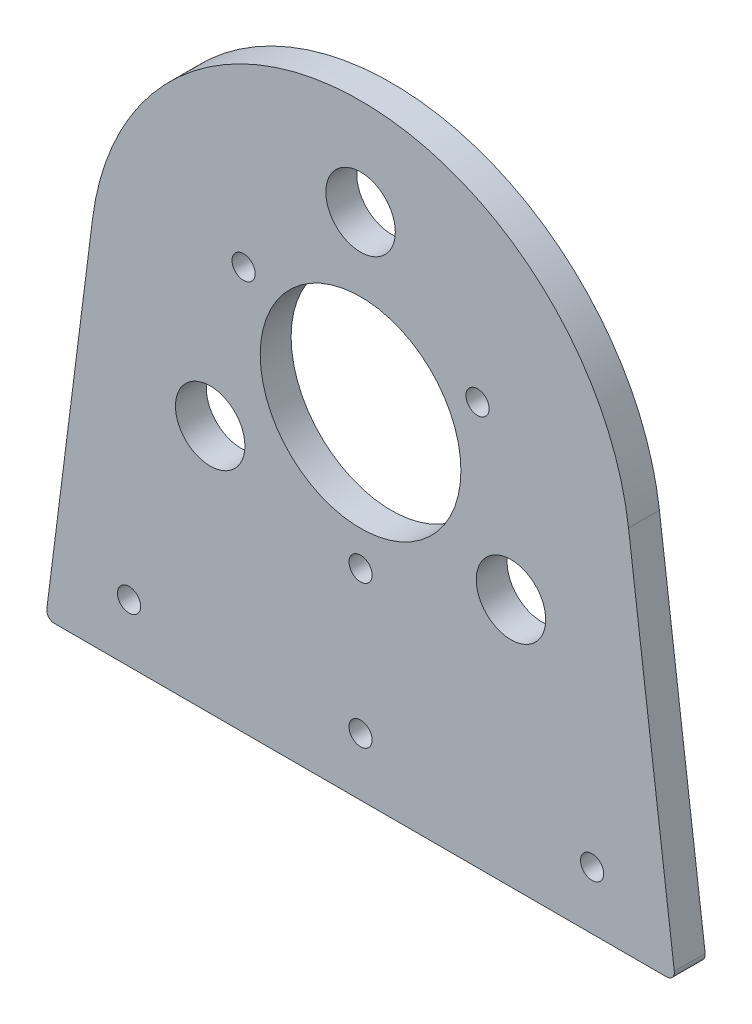
ISO-10303-21;
HEADER;
FILE_DESCRIPTION(('STEP AP214'),'2;1');
FILE_NAME('part.step','',(''),(''),'','','');
FILE_SCHEMA(('AUTOMOTIVE_DESIGN { 1 0 10303 214 1 1 1 1 }'));
ENDSEC;
DATA;
#1=APPLICATION_CONTEXT('core data for automotive mechanical design processes');
#2=APPLICATION_PROTOCOL_DEFINITION('international standard','automotive_design',2000,#1);
#3=PRODUCT_CONTEXT('',#1,'mechanical');
#4=PRODUCT('Part','Part','',(#3));
#5=PRODUCT_RELATED_PRODUCT_CATEGORY('part','',(#4));
#6=PRODUCT_DEFINITION_FORMATION('','',#4);
#7=PRODUCT_DEFINITION_CONTEXT('part definition',#1,'design');
#8=PRODUCT_DEFINITION('design','',#6,#7);
#9=PRODUCT_DEFINITION_SHAPE('','',#8);
#10=(LENGTH_UNIT() NAMED_UNIT(*) SI_UNIT(.MILLI.,.METRE.));
#11=(NAMED_UNIT(*) PLANE_ANGLE_UNIT() SI_UNIT($,.RADIAN.));
#12=(NAMED_UNIT(*) SI_UNIT($,.STERADIAN.) SOLID_ANGLE_UNIT());
#13=UNCERTAINTY_MEASURE_WITH_UNIT(LENGTH_MEASURE(1.E-05),#10,'distance_accuracy_value','');
#14=(GEOMETRIC_REPRESENTATION_CONTEXT(3) GLOBAL_UNCERTAINTY_ASSIGNED_CONTEXT((#13)) GLOBAL_UNIT_ASSIGNED_CONTEXT((#10,
#11,#12)) REPRESENTATION_CONTEXT('',''));
#15=CARTESIAN_POINT('',(0.,0.,0.));
#16=DIRECTION('',(0.,0.,1.));
#17=DIRECTION('',(1.,0.,0.));
#18=AXIS2_PLACEMENT_3D('',#15,#16,#17);
#19=CARTESIAN_POINT('',(0.,0.,4.));
#20=DIRECTION('',(0.,0.,1.));
#21=DIRECTION('',(1.,0.,0.));
#22=AXIS2_PLACEMENT_3D('',#19,#20,#21);
#23=PLANE('',#22);
#24=DIRECTION('',(1.,0.,0.));
#25=VECTOR('',#24,1.);
#26=CARTESIAN_POINT('',(-88.7167777972279,-43.5,4.));
#27=LINE('',#26,#25);
#28=CARTESIAN_POINT('',(-39.6607127436829,-43.5,4.));
#29=VERTEX_POINT('',#28);
#30=CARTESIAN_POINT('',(39.6607127436829,-43.5,4.));
#31=VERTEX_POINT('',#30);
#32=EDGE_CURVE('E162',#29,#31,#27,.T.);
#33=ORIENTED_EDGE('',*,*,#32,.T.);
#34=CARTESIAN_POINT('',(39.6607127436829,-42.5,4.));
#35=DIRECTION('',(0.,0.,1.));
#36=DIRECTION('',(1.,0.,0.));
#37=AXIS2_PLACEMENT_3D('',#34,#35,#36);
#38=CIRCLE('',#37,1.);
#39=CARTESIAN_POINT('',(40.6527706798289,-42.3742182392805,4.));
#40=VERTEX_POINT('',#39);
#41=EDGE_CURVE('E112',#31,#40,#38,.T.);
#42=ORIENTED_EDGE('',*,*,#41,.T.);
#43=DIRECTION('',(0.125781760719489,-0.992057936146022,0.));
#44=VECTOR('',#43,1.);
#45=CARTESIAN_POINT('',(34.7220277651108,4.40236162518213,4.));
#46=LINE('',#45,#44);
#47=CARTESIAN_POINT('',(34.7220277651108,4.40236162518213,4.));
#48=VERTEX_POINT('',#47);
#49=EDGE_CURVE('E93',#48,#40,#46,.T.);
#50=ORIENTED_EDGE('',*,*,#49,.F.);
#51=CARTESIAN_POINT('',(0.,0.,4.));
#52=DIRECTION('',(0.,0.,1.));
#53=DIRECTION('',(1.,0.,0.));
#54=AXIS2_PLACEMENT_3D('',#51,#52,#53);
#55=CIRCLE('',#54,35.);
#56=CARTESIAN_POINT('',(-34.7220277651108,4.40236162518212,4.));
#57=VERTEX_POINT('',#56);
#58=EDGE_CURVE('E103',#48,#57,#55,.T.);
#59=ORIENTED_EDGE('',*,*,#58,.T.);
#60=DIRECTION('',(0.125781760719489,0.992057936146022,0.));
#61=VECTOR('',#60,1.);
#62=CARTESIAN_POINT('',(-34.7220277651108,4.40236162518211,4.));
#63=LINE('',#62,#61);
#64=CARTESIAN_POINT('',(-40.6527706798289,-42.3742182392805,4.));
#65=VERTEX_POINT('',#64);
#66=EDGE_CURVE('E113',#65,#57,#63,.T.);
#67=ORIENTED_EDGE('',*,*,#66,.F.);
#68=CARTESIAN_POINT('',(-39.6607127436829,-42.5,4.));
#69=DIRECTION('',(0.,0.,1.));
#70=DIRECTION('',(1.,0.,0.));
#71=AXIS2_PLACEMENT_3D('',#68,#69,#70);
#72=CIRCLE('',#71,1.);
#73=EDGE_CURVE('E147',#65,#29,#72,.T.);
#74=ORIENTED_EDGE('',*,*,#73,.T.);
#75=EDGE_LOOP('',(#33,#42,#50,#59,#67,#74));
#76=FACE_BOUND('',#75,.T.);
#77=CARTESIAN_POINT('',(0.,-36.,4.));
#78=DIRECTION('',(0.,0.,-1.));
#79=DIRECTION('',(-1.,0.,0.));
#80=AXIS2_PLACEMENT_3D('',#77,#78,#79);
#81=CIRCLE('',#80,1.5);
#82=CARTESIAN_POINT('',(-1.50000000000001,-36.,4.));
#83=VERTEX_POINT('',#82);
#84=EDGE_CURVE('E202',#83,#83,#81,.T.);
#85=ORIENTED_EDGE('',*,*,#84,.T.);
#86=EDGE_LOOP('',(#85));
#87=FACE_BOUND('',#86,.T.);
#88=CARTESIAN_POINT('',(-19.4855715851501,-11.2499999999997,4.));
#89=DIRECTION('',(0.,0.,1.));
#90=DIRECTION('',(-0.499999999999986,0.866025403784447,0.));
#91=AXIS2_PLACEMENT_3D('',#88,#89,#90);
#92=CIRCLE('',#91,4.5);
#93=CARTESIAN_POINT('',(-21.73557158515,-7.35288568296967,4.));
#94=VERTEX_POINT('',#93);
#95=EDGE_CURVE('E141',#94,#94,#92,.T.);
#96=ORIENTED_EDGE('',*,*,#95,.F.);
#97=EDGE_LOOP('',(#96));
#98=FACE_BOUND('',#97,.T.);
#99=CARTESIAN_POINT('',(19.4855715851498,-11.2500000000002,4.));
#100=DIRECTION('',(0.,0.,1.));
#101=DIRECTION('',(-0.500000000000007,-0.866025403784435,0.));
#102=AXIS2_PLACEMENT_3D('',#99,#100,#101);
#103=CIRCLE('',#102,4.5);
#104=CARTESIAN_POINT('',(17.2355715851497,-15.1471143170301,4.));
#105=VERTEX_POINT('',#104);
#106=EDGE_CURVE('E137',#105,#105,#103,.T.);
#107=ORIENTED_EDGE('',*,*,#106,.F.);
#108=EDGE_LOOP('',(#107));
#109=FACE_BOUND('',#108,.T.);
#110=CARTESIAN_POINT('',(-30.,-36.,4.));
#111=DIRECTION('',(0.,0.,1.));
#112=DIRECTION('',(1.,0.,0.));
#113=AXIS2_PLACEMENT_3D('',#110,#111,#112);
#114=CIRCLE('',#113,1.5);
#115=CARTESIAN_POINT('',(-28.5,-36.,4.));
#116=VERTEX_POINT('',#115);
#117=EDGE_CURVE('E211',#116,#116,#114,.T.);
#118=ORIENTED_EDGE('',*,*,#117,.F.);
#119=EDGE_LOOP('',(#118));
#120=FACE_BOUND('',#119,.T.);
#121=CARTESIAN_POINT('',(30.,-36.,4.));
#122=DIRECTION('',(0.,0.,-1.));
#123=DIRECTION('',(-1.,0.,0.));
#124=AXIS2_PLACEMENT_3D('',#121,#122,#123);
#125=CIRCLE('',#124,1.5);
#126=CARTESIAN_POINT('',(28.5,-36.,4.));
#127=VERTEX_POINT('',#126);
#128=EDGE_CURVE('E217',#127,#127,#125,.T.);
#129=ORIENTED_EDGE('',*,*,#128,.T.);
#130=EDGE_LOOP('',(#129));
#131=FACE_BOUND('',#130,.T.);
#132=CARTESIAN_POINT('',(-15.1554445662276,8.75000000000007,4.));
#133=DIRECTION('',(0.,0.,1.));
#134=DIRECTION('',(1.,0.,0.));
#135=AXIS2_PLACEMENT_3D('',#132,#133,#134);
#136=CIRCLE('',#135,1.5);
#137=CARTESIAN_POINT('',(-13.6554445662276,8.75000000000007,4.));
#138=VERTEX_POINT('',#137);
#139=EDGE_CURVE('E227',#138,#138,#136,.T.);
#140=ORIENTED_EDGE('',*,*,#139,.F.);
#141=EDGE_LOOP('',(#140));
#142=FACE_BOUND('',#141,.T.);
#143=CARTESIAN_POINT('',(0.,-17.5,4.));
#144=DIRECTION('',(0.,0.,1.));
#145=DIRECTION('',(1.,0.,0.));
#146=AXIS2_PLACEMENT_3D('',#143,#144,#145);
#147=CIRCLE('',#146,1.5);
#148=CARTESIAN_POINT('',(1.5,-17.5,4.));
#149=VERTEX_POINT('',#148);
#150=EDGE_CURVE('E220',#149,#149,#147,.T.);
#151=ORIENTED_EDGE('',*,*,#150,.F.);
#152=EDGE_LOOP('',(#151));
#153=FACE_BOUND('',#152,.T.);
#154=CARTESIAN_POINT('',(15.1554445662276,8.75000000000008,4.));
#155=DIRECTION('',(0.,0.,1.));
#156=DIRECTION('',(1.,0.,0.));
#157=AXIS2_PLACEMENT_3D('',#154,#155,#156);
#158=CIRCLE('',#157,1.5);
#159=CARTESIAN_POINT('',(16.6554445662276,8.75000000000008,4.));
#160=VERTEX_POINT('',#159);
#161=EDGE_CURVE('E226',#160,#160,#158,.T.);
#162=ORIENTED_EDGE('',*,*,#161,.F.);
#163=EDGE_LOOP('',(#162));
#164=FACE_BOUND('',#163,.T.);
#165=CARTESIAN_POINT('',(0.,22.5,4.));
#166=DIRECTION('',(0.,0.,1.));
#167=DIRECTION('',(1.,0.,0.));
#168=AXIS2_PLACEMENT_3D('',#165,#166,#167);
#169=CIRCLE('',#168,4.5);
#170=CARTESIAN_POINT('',(4.5,22.5,4.));
#171=VERTEX_POINT('',#170);
#172=EDGE_CURVE('E132',#171,#171,#169,.T.);
#173=ORIENTED_EDGE('',*,*,#172,.F.);
#174=EDGE_LOOP('',(#173));
#175=FACE_BOUND('',#174,.T.);
#176=CARTESIAN_POINT('',(0.,0.,4.));
#177=DIRECTION('',(0.,0.,1.));
#178=DIRECTION('',(1.,0.,0.));
#179=AXIS2_PLACEMENT_3D('',#176,#177,#178);
#180=CIRCLE('',#179,13.);
#181=CARTESIAN_POINT('',(13.,0.,4.));
#182=VERTEX_POINT('',#181);
#183=EDGE_CURVE('E108',#182,#182,#180,.T.);
#184=ORIENTED_EDGE('',*,*,#183,.F.);
#185=EDGE_LOOP('',(#184));
#186=FACE_BOUND('',#185,.T.);
#187=ADVANCED_FACE('F38',(#76,#87,#98,#109,#120,#131,#142,#153,#164,#175,#186),#23,.T.);
#188=CARTESIAN_POINT('',(0.,0.,0.));
#189=DIRECTION('',(0.,0.,1.));
#190=DIRECTION('',(1.,0.,0.));
#191=AXIS2_PLACEMENT_3D('',#188,#189,#190);
#192=PLANE('',#191);
#193=CARTESIAN_POINT('',(0.,-36.,0.));
#194=DIRECTION('',(0.,0.,-1.));
#195=DIRECTION('',(-1.,0.,0.));
#196=AXIS2_PLACEMENT_3D('',#193,#194,#195);
#197=CIRCLE('',#196,1.5);
#198=CARTESIAN_POINT('',(-1.50000000000001,-36.,0.));
#199=VERTEX_POINT('',#198);
#200=EDGE_CURVE('E199',#199,#199,#197,.T.);
#201=ORIENTED_EDGE('',*,*,#200,.F.);
#202=EDGE_LOOP('',(#201));
#203=FACE_BOUND('',#202,.T.);
#204=CARTESIAN_POINT('',(-19.4855715851501,-11.2499999999997,0.));
#205=DIRECTION('',(0.,0.,1.));
#206=DIRECTION('',(1.,0.,0.));
#207=AXIS2_PLACEMENT_3D('',#204,#205,#206);
#208=CIRCLE('',#207,4.5);
#209=CARTESIAN_POINT('',(-14.9855715851501,-11.2499999999997,0.));
#210=VERTEX_POINT('',#209);
#211=EDGE_CURVE('E138',#210,#210,#208,.T.);
#212=ORIENTED_EDGE('',*,*,#211,.T.);
#213=EDGE_LOOP('',(#212));
#214=FACE_BOUND('',#213,.T.);
#215=CARTESIAN_POINT('',(19.4855715851498,-11.2500000000002,0.));
#216=DIRECTION('',(0.,0.,1.));
#217=DIRECTION('',(1.,0.,0.));
#218=AXIS2_PLACEMENT_3D('',#215,#216,#217);
#219=CIRCLE('',#218,4.5);
#220=CARTESIAN_POINT('',(23.9855715851498,-11.2500000000002,0.));
#221=VERTEX_POINT('',#220);
#222=EDGE_CURVE('E133',#221,#221,#219,.T.);
#223=ORIENTED_EDGE('',*,*,#222,.T.);
#224=EDGE_LOOP('',(#223));
#225=FACE_BOUND('',#224,.T.);
#226=CARTESIAN_POINT('',(0.,0.,0.));
#227=DIRECTION('',(0.,0.,1.));
#228=DIRECTION('',(1.,0.,0.));
#229=AXIS2_PLACEMENT_3D('',#226,#227,#228);
#230=CIRCLE('',#229,13.);
#231=CARTESIAN_POINT('',(13.,0.,0.));
#232=VERTEX_POINT('',#231);
#233=EDGE_CURVE('E115',#232,#232,#230,.T.);
#234=ORIENTED_EDGE('',*,*,#233,.T.);
#235=EDGE_LOOP('',(#234));
#236=FACE_BOUND('',#235,.T.);
#237=CARTESIAN_POINT('',(0.,22.5,0.));
#238=DIRECTION('',(0.,0.,1.));
#239=DIRECTION('',(1.,0.,0.));
#240=AXIS2_PLACEMENT_3D('',#237,#238,#239);
#241=CIRCLE('',#240,4.5);
#242=CARTESIAN_POINT('',(4.5,22.5,0.));
#243=VERTEX_POINT('',#242);
#244=EDGE_CURVE('E123',#243,#243,#241,.T.);
#245=ORIENTED_EDGE('',*,*,#244,.T.);
#246=EDGE_LOOP('',(#245));
#247=FACE_BOUND('',#246,.T.);
#248=CARTESIAN_POINT('',(15.1554445662276,8.75000000000008,0.));
#249=DIRECTION('',(0.,0.,1.));
#250=DIRECTION('',(1.,0.,0.));
#251=AXIS2_PLACEMENT_3D('',#248,#249,#250);
#252=CIRCLE('',#251,1.5);
#253=CARTESIAN_POINT('',(16.6554445662276,8.75000000000008,0.));
#254=VERTEX_POINT('',#253);
#255=EDGE_CURVE('E235',#254,#254,#252,.T.);
#256=ORIENTED_EDGE('',*,*,#255,.T.);
#257=EDGE_LOOP('',(#256));
#258=FACE_BOUND('',#257,.T.);
#259=CARTESIAN_POINT('',(0.,-17.5,0.));
#260=DIRECTION('',(0.,0.,1.));
#261=DIRECTION('',(1.,0.,0.));
#262=AXIS2_PLACEMENT_3D('',#259,#260,#261);
#263=CIRCLE('',#262,1.5);
#264=CARTESIAN_POINT('',(1.5,-17.5,0.));
#265=VERTEX_POINT('',#264);
#266=EDGE_CURVE('E230',#265,#265,#263,.T.);
#267=ORIENTED_EDGE('',*,*,#266,.T.);
#268=EDGE_LOOP('',(#267));
#269=FACE_BOUND('',#268,.T.);
#270=CARTESIAN_POINT('',(-15.1554445662276,8.75000000000007,0.));
#271=DIRECTION('',(0.,0.,1.));
#272=DIRECTION('',(1.,0.,0.));
#273=AXIS2_PLACEMENT_3D('',#270,#271,#272);
#274=CIRCLE('',#273,1.5);
#275=CARTESIAN_POINT('',(-13.6554445662276,8.75000000000007,0.));
#276=VERTEX_POINT('',#275);
#277=EDGE_CURVE('E223',#276,#276,#274,.T.);
#278=ORIENTED_EDGE('',*,*,#277,.T.);
#279=EDGE_LOOP('',(#278));
#280=FACE_BOUND('',#279,.T.);
#281=DIRECTION('',(0.125781760719489,-0.992057936146022,0.));
#282=VECTOR('',#281,1.);
#283=CARTESIAN_POINT('',(34.7220277651108,4.40236162518213,0.));
#284=LINE('',#283,#282);
#285=CARTESIAN_POINT('',(34.7220277651108,4.40236162518213,0.));
#286=VERTEX_POINT('',#285);
#287=CARTESIAN_POINT('',(40.6527706798289,-42.3742182392805,0.));
#288=VERTEX_POINT('',#287);
#289=EDGE_CURVE('E94',#286,#288,#284,.T.);
#290=ORIENTED_EDGE('',*,*,#289,.T.);
#291=CARTESIAN_POINT('',(39.6607127436829,-42.5,0.));
#292=DIRECTION('',(0.,0.,1.));
#293=DIRECTION('',(1.,0.,0.));
#294=AXIS2_PLACEMENT_3D('',#291,#292,#293);
#295=CIRCLE('',#294,1.);
#296=CARTESIAN_POINT('',(39.6607127436829,-43.5,0.));
#297=VERTEX_POINT('',#296);
#298=EDGE_CURVE('E46',#288,#297,#295,.F.);
#299=ORIENTED_EDGE('',*,*,#298,.T.);
#300=DIRECTION('',(1.,0.,0.));
#301=VECTOR('',#300,1.);
#302=CARTESIAN_POINT('',(-88.7167777972279,-43.5,0.));
#303=LINE('',#302,#301);
#304=CARTESIAN_POINT('',(-39.6607127436829,-43.5,0.));
#305=VERTEX_POINT('',#304);
#306=EDGE_CURVE('E155',#305,#297,#303,.T.);
#307=ORIENTED_EDGE('',*,*,#306,.F.);
#308=CARTESIAN_POINT('',(-39.6607127436829,-42.5,0.));
#309=DIRECTION('',(0.,0.,1.));
#310=DIRECTION('',(1.,0.,0.));
#311=AXIS2_PLACEMENT_3D('',#308,#309,#310);
#312=CIRCLE('',#311,1.);
#313=CARTESIAN_POINT('',(-40.6527706798289,-42.3742182392805,0.));
#314=VERTEX_POINT('',#313);
#315=EDGE_CURVE('E53',#305,#314,#312,.F.);
#316=ORIENTED_EDGE('',*,*,#315,.T.);
#317=DIRECTION('',(0.125781760719489,0.992057936146022,0.));
#318=VECTOR('',#317,1.);
#319=CARTESIAN_POINT('',(-34.7220277651108,4.40236162518211,0.));
#320=LINE('',#319,#318);
#321=CARTESIAN_POINT('',(-34.7220277651108,4.40236162518212,0.));
#322=VERTEX_POINT('',#321);
#323=EDGE_CURVE('E121',#314,#322,#320,.T.);
#324=ORIENTED_EDGE('',*,*,#323,.T.);
#325=CARTESIAN_POINT('',(0.,0.,0.));
#326=DIRECTION('',(0.,0.,1.));
#327=DIRECTION('',(1.,0.,0.));
#328=AXIS2_PLACEMENT_3D('',#325,#326,#327);
#329=CIRCLE('',#328,35.);
#330=EDGE_CURVE('E125',#286,#322,#329,.T.);
#331=ORIENTED_EDGE('',*,*,#330,.F.);
#332=EDGE_LOOP('',(#290,#299,#307,#316,#324,#331));
#333=FACE_BOUND('',#332,.T.);
#334=CARTESIAN_POINT('',(30.,-36.,0.));
#335=DIRECTION('',(0.,0.,-1.));
#336=DIRECTION('',(-1.,0.,0.));
#337=AXIS2_PLACEMENT_3D('',#334,#335,#336);
#338=CIRCLE('',#337,1.5);
#339=CARTESIAN_POINT('',(28.5,-36.,0.));
#340=VERTEX_POINT('',#339);
#341=EDGE_CURVE('E214',#340,#340,#338,.T.);
#342=ORIENTED_EDGE('',*,*,#341,.F.);
#343=EDGE_LOOP('',(#342));
#344=FACE_BOUND('',#343,.T.);
#345=CARTESIAN_POINT('',(-30.,-36.,0.));
#346=DIRECTION('',(0.,0.,1.));
#347=DIRECTION('',(1.,0.,0.));
#348=AXIS2_PLACEMENT_3D('',#345,#346,#347);
#349=CIRCLE('',#348,1.5);
#350=CARTESIAN_POINT('',(-28.5,-36.,0.));
#351=VERTEX_POINT('',#350);
#352=EDGE_CURVE('E136',#351,#351,#349,.T.);
#353=ORIENTED_EDGE('',*,*,#352,.T.);
#354=EDGE_LOOP('',(#353));
#355=FACE_BOUND('',#354,.T.);
#356=ADVANCED_FACE('F153',(#203,#214,#225,#236,#247,#258,#269,#280,#333,#344,#355),#192,.F.);
#357=CARTESIAN_POINT('',(-34.7220277651108,4.40236162518211,4.));
#358=DIRECTION('',(-0.992057936146022,0.125781760719489,0.));
#359=DIRECTION('',(-0.125781760719489,-0.992057936146022,0.));
#360=AXIS2_PLACEMENT_3D('',#357,#358,#359);
#361=PLANE('',#360);
#362=ORIENTED_EDGE('',*,*,#323,.F.);
#363=DIRECTION('',(0.,0.,-1.));
#364=VECTOR('',#363,1.);
#365=CARTESIAN_POINT('',(-40.6527706798289,-42.3742182392805,4.));
#366=LINE('',#365,#364);
#367=EDGE_CURVE('E11',#314,#65,#366,.F.);
#368=ORIENTED_EDGE('',*,*,#367,.T.);
#369=ORIENTED_EDGE('',*,*,#66,.T.);
#370=DIRECTION('',(0.,0.,-1.));
#371=VECTOR('',#370,1.);
#372=CARTESIAN_POINT('',(-34.7220277651108,4.40236162518212,4.));
#373=LINE('',#372,#371);
#374=EDGE_CURVE('E99',#57,#322,#373,.T.);
#375=ORIENTED_EDGE('',*,*,#374,.T.);
#376=EDGE_LOOP('',(#362,#368,#369,#375));
#377=FACE_BOUND('',#376,.T.);
#378=ADVANCED_FACE('F179',(#377),#361,.T.);
#379=CARTESIAN_POINT('',(34.7220277651108,4.40236162518213,4.));
#380=DIRECTION('',(0.992057936146022,0.125781760719489,0.));
#381=DIRECTION('',(-0.125781760719489,0.992057936146022,0.));
#382=AXIS2_PLACEMENT_3D('',#379,#380,#381);
#383=PLANE('',#382);
#384=ORIENTED_EDGE('',*,*,#49,.T.);
#385=DIRECTION('',(0.,0.,1.));
#386=VECTOR('',#385,1.);
#387=CARTESIAN_POINT('',(40.6527706798289,-42.3742182392805,0.));
#388=LINE('',#387,#386);
#389=EDGE_CURVE('E61',#40,#288,#388,.F.);
#390=ORIENTED_EDGE('',*,*,#389,.T.);
#391=ORIENTED_EDGE('',*,*,#289,.F.);
#392=DIRECTION('',(0.,0.,-1.));
#393=VECTOR('',#392,1.);
#394=CARTESIAN_POINT('',(34.7220277651108,4.40236162518213,4.));
#395=LINE('',#394,#393);
#396=EDGE_CURVE('E89',#48,#286,#395,.T.);
#397=ORIENTED_EDGE('',*,*,#396,.F.);
#398=EDGE_LOOP('',(#384,#390,#391,#397));
#399=FACE_BOUND('',#398,.T.);
#400=ADVANCED_FACE('F91',(#399),#383,.T.);
#401=CARTESIAN_POINT('',(0.,0.,4.));
#402=DIRECTION('',(0.,0.,-1.));
#403=DIRECTION('',(-1.,0.,0.));
#404=AXIS2_PLACEMENT_3D('',#401,#402,#403);
#405=CYLINDRICAL_SURFACE('',#404,35.);
#406=ORIENTED_EDGE('',*,*,#330,.T.);
#407=ORIENTED_EDGE('',*,*,#374,.F.);
#408=ORIENTED_EDGE('',*,*,#58,.F.);
#409=ORIENTED_EDGE('',*,*,#396,.T.);
#410=EDGE_LOOP('',(#406,#407,#408,#409));
#411=FACE_BOUND('',#410,.T.);
#412=ADVANCED_FACE('F104',(#411),#405,.T.);
#413=CARTESIAN_POINT('',(0.,0.,4.));
#414=DIRECTION('',(0.,0.,-1.));
#415=DIRECTION('',(-1.,0.,0.));
#416=AXIS2_PLACEMENT_3D('',#413,#414,#415);
#417=CYLINDRICAL_SURFACE('',#416,13.);
#418=ORIENTED_EDGE('',*,*,#183,.T.);
#419=EDGE_LOOP('',(#418));
#420=FACE_BOUND('',#419,.T.);
#421=ORIENTED_EDGE('',*,*,#233,.F.);
#422=EDGE_LOOP('',(#421));
#423=FACE_BOUND('',#422,.T.);
#424=ADVANCED_FACE('F186',(#420,#423),#417,.F.);
#425=CARTESIAN_POINT('',(0.,22.5,-6.));
#426=DIRECTION('',(0.,0.,1.));
#427=DIRECTION('',(1.,0.,0.));
#428=AXIS2_PLACEMENT_3D('',#425,#426,#427);
#429=CYLINDRICAL_SURFACE('',#428,4.5);
#430=ORIENTED_EDGE('',*,*,#172,.T.);
#431=EDGE_LOOP('',(#430));
#432=FACE_BOUND('',#431,.T.);
#433=ORIENTED_EDGE('',*,*,#244,.F.);
#434=EDGE_LOOP('',(#433));
#435=FACE_BOUND('',#434,.T.);
#436=ADVANCED_FACE('F183',(#432,#435),#429,.F.);
#437=CARTESIAN_POINT('',(15.1554445662276,8.75000000000008,0.));
#438=DIRECTION('',(0.,0.,1.));
#439=DIRECTION('',(1.,0.,0.));
#440=AXIS2_PLACEMENT_3D('',#437,#438,#439);
#441=CYLINDRICAL_SURFACE('',#440,1.5);
#442=ORIENTED_EDGE('',*,*,#255,.F.);
#443=EDGE_LOOP('',(#442));
#444=FACE_BOUND('',#443,.T.);
#445=ORIENTED_EDGE('',*,*,#161,.T.);
#446=EDGE_LOOP('',(#445));
#447=FACE_BOUND('',#446,.T.);
#448=ADVANCED_FACE('F271',(#444,#447),#441,.F.);
#449=CARTESIAN_POINT('',(0.,-17.5,0.));
#450=DIRECTION('',(0.,0.,1.));
#451=DIRECTION('',(1.,0.,0.));
#452=AXIS2_PLACEMENT_3D('',#449,#450,#451);
#453=CYLINDRICAL_SURFACE('',#452,1.5);
#454=ORIENTED_EDGE('',*,*,#266,.F.);
#455=EDGE_LOOP('',(#454));
#456=FACE_BOUND('',#455,.T.);
#457=ORIENTED_EDGE('',*,*,#150,.T.);
#458=EDGE_LOOP('',(#457));
#459=FACE_BOUND('',#458,.T.);
#460=ADVANCED_FACE('F262',(#456,#459),#453,.F.);
#461=CARTESIAN_POINT('',(-15.1554445662276,8.75000000000007,0.));
#462=DIRECTION('',(0.,0.,1.));
#463=DIRECTION('',(1.,0.,0.));
#464=AXIS2_PLACEMENT_3D('',#461,#462,#463);
#465=CYLINDRICAL_SURFACE('',#464,1.5);
#466=ORIENTED_EDGE('',*,*,#277,.F.);
#467=EDGE_LOOP('',(#466));
#468=FACE_BOUND('',#467,.T.);
#469=ORIENTED_EDGE('',*,*,#139,.T.);
#470=EDGE_LOOP('',(#469));
#471=FACE_BOUND('',#470,.T.);
#472=ADVANCED_FACE('F258',(#468,#471),#465,.F.);
#473=CARTESIAN_POINT('',(30.,-36.,4.));
#474=DIRECTION('',(0.,0.,-1.));
#475=DIRECTION('',(-1.,0.,0.));
#476=AXIS2_PLACEMENT_3D('',#473,#474,#475);
#477=CYLINDRICAL_SURFACE('',#476,1.5);
#478=ORIENTED_EDGE('',*,*,#128,.F.);
#479=EDGE_LOOP('',(#478));
#480=FACE_BOUND('',#479,.T.);
#481=ORIENTED_EDGE('',*,*,#341,.T.);
#482=EDGE_LOOP('',(#481));
#483=FACE_BOUND('',#482,.T.);
#484=ADVANCED_FACE('F261',(#480,#483),#477,.F.);
#485=CARTESIAN_POINT('',(-30.,-36.,4.));
#486=DIRECTION('',(0.,0.,-1.));
#487=DIRECTION('',(-1.,0.,0.));
#488=AXIS2_PLACEMENT_3D('',#485,#486,#487);
#489=CYLINDRICAL_SURFACE('',#488,1.5);
#490=ORIENTED_EDGE('',*,*,#117,.T.);
#491=EDGE_LOOP('',(#490));
#492=FACE_BOUND('',#491,.T.);
#493=ORIENTED_EDGE('',*,*,#352,.F.);
#494=EDGE_LOOP('',(#493));
#495=FACE_BOUND('',#494,.T.);
#496=ADVANCED_FACE('F283',(#492,#495),#489,.F.);
#497=CARTESIAN_POINT('',(19.4855715851498,-11.2500000000002,-6.));
#498=DIRECTION('',(0.,0.,1.));
#499=DIRECTION('',(1.,0.,0.));
#500=AXIS2_PLACEMENT_3D('',#497,#498,#499);
#501=CYLINDRICAL_SURFACE('',#500,4.5);
#502=ORIENTED_EDGE('',*,*,#106,.T.);
#503=EDGE_LOOP('',(#502));
#504=FACE_BOUND('',#503,.T.);
#505=ORIENTED_EDGE('',*,*,#222,.F.);
#506=EDGE_LOOP('',(#505));
#507=FACE_BOUND('',#506,.T.);
#508=ADVANCED_FACE('F287',(#504,#507),#501,.F.);
#509=CARTESIAN_POINT('',(-19.4855715851501,-11.2499999999997,-6.));
#510=DIRECTION('',(0.,0.,1.));
#511=DIRECTION('',(1.,0.,0.));
#512=AXIS2_PLACEMENT_3D('',#509,#510,#511);
#513=CYLINDRICAL_SURFACE('',#512,4.5);
#514=ORIENTED_EDGE('',*,*,#95,.T.);
#515=EDGE_LOOP('',(#514));
#516=FACE_BOUND('',#515,.T.);
#517=ORIENTED_EDGE('',*,*,#211,.F.);
#518=EDGE_LOOP('',(#517));
#519=FACE_BOUND('',#518,.T.);
#520=ADVANCED_FACE('F291',(#516,#519),#513,.F.);
#521=CARTESIAN_POINT('',(0.,-36.,4.));
#522=DIRECTION('',(0.,0.,-1.));
#523=DIRECTION('',(-1.,0.,0.));
#524=AXIS2_PLACEMENT_3D('',#521,#522,#523);
#525=CYLINDRICAL_SURFACE('',#524,1.5);
#526=ORIENTED_EDGE('',*,*,#84,.F.);
#527=EDGE_LOOP('',(#526));
#528=FACE_BOUND('',#527,.T.);
#529=ORIENTED_EDGE('',*,*,#200,.T.);
#530=EDGE_LOOP('',(#529));
#531=FACE_BOUND('',#530,.T.);
#532=ADVANCED_FACE('F171',(#528,#531),#525,.F.);
#533=CARTESIAN_POINT('',(-88.7167777972279,-43.5,4.));
#534=DIRECTION('',(0.,1.,0.));
#535=DIRECTION('',(-1.,0.,0.));
#536=AXIS2_PLACEMENT_3D('',#533,#534,#535);
#537=PLANE('',#536);
#538=ORIENTED_EDGE('',*,*,#306,.T.);
#539=DIRECTION('',(0.,0.,1.));
#540=VECTOR('',#539,1.);
#541=CARTESIAN_POINT('',(39.6607127436829,-43.5,4.));
#542=LINE('',#541,#540);
#543=EDGE_CURVE('E144',#297,#31,#542,.T.);
#544=ORIENTED_EDGE('',*,*,#543,.T.);
#545=ORIENTED_EDGE('',*,*,#32,.F.);
#546=DIRECTION('',(0.,0.,-1.));
#547=VECTOR('',#546,1.);
#548=CARTESIAN_POINT('',(-39.6607127436829,-43.5,0.));
#549=LINE('',#548,#547);
#550=EDGE_CURVE('E98',#29,#305,#549,.T.);
#551=ORIENTED_EDGE('',*,*,#550,.T.);
#552=EDGE_LOOP('',(#538,#544,#545,#551));
#553=FACE_BOUND('',#552,.T.);
#554=ADVANCED_FACE('F159',(#553),#537,.F.);
#555=CARTESIAN_POINT('',(39.6607127436829,-42.5,4.));
#556=DIRECTION('',(0.,0.,-1.));
#557=DIRECTION('',(-1.,0.,0.));
#558=AXIS2_PLACEMENT_3D('',#555,#556,#557);
#559=CYLINDRICAL_SURFACE('',#558,1.);
#560=ORIENTED_EDGE('',*,*,#298,.F.);
#561=ORIENTED_EDGE('',*,*,#389,.F.);
#562=ORIENTED_EDGE('',*,*,#41,.F.);
#563=ORIENTED_EDGE('',*,*,#543,.F.);
#564=EDGE_LOOP('',(#560,#561,#562,#563));
#565=FACE_BOUND('',#564,.T.);
#566=ADVANCED_FACE('F164',(#565),#559,.T.);
#567=CARTESIAN_POINT('',(-39.6607127436829,-42.5,4.));
#568=DIRECTION('',(0.,0.,1.));
#569=DIRECTION('',(1.,0.,0.));
#570=AXIS2_PLACEMENT_3D('',#567,#568,#569);
#571=CYLINDRICAL_SURFACE('',#570,1.);
#572=ORIENTED_EDGE('',*,*,#73,.F.);
#573=ORIENTED_EDGE('',*,*,#367,.F.);
#574=ORIENTED_EDGE('',*,*,#315,.F.);
#575=ORIENTED_EDGE('',*,*,#550,.F.);
#576=EDGE_LOOP('',(#572,#573,#574,#575));
#577=FACE_BOUND('',#576,.T.);
#578=ADVANCED_FACE('F40',(#577),#571,.T.);
#579=CLOSED_SHELL('',(#187,#356,#378,#400,#412,#424,#436,#448,#460,#472,#484,#496,#508,#520,
#532,#554,#566,#578));
#580=MANIFOLD_SOLID_BREP('B2',#579);
#581=ADVANCED_BREP_SHAPE_REPRESENTATION('',(#18,#580),#14);
#582=SHAPE_DEFINITION_REPRESENTATION(#9,#581);
ENDSEC;
END-ISO-10303-21;
